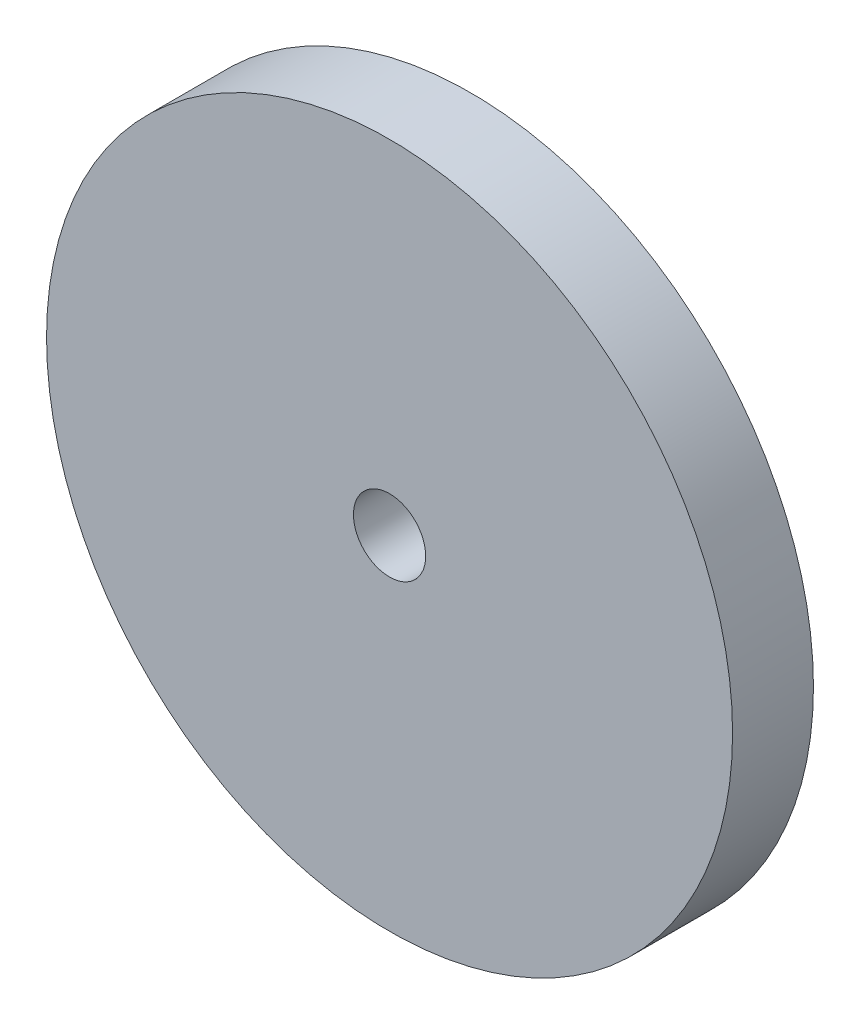
ISO-10303-21;
HEADER;
FILE_DESCRIPTION(('STEP AP214'),'2;1');
FILE_NAME('part.step','',(''),(''),'','','');
FILE_SCHEMA(('AUTOMOTIVE_DESIGN { 1 0 10303 214 1 1 1 1 }'));
ENDSEC;
DATA;
#1=APPLICATION_CONTEXT('core data for automotive mechanical design processes');
#2=APPLICATION_PROTOCOL_DEFINITION('international standard','automotive_design',2000,#1);
#3=PRODUCT_CONTEXT('',#1,'mechanical');
#4=PRODUCT('Part','Part','',(#3));
#5=PRODUCT_RELATED_PRODUCT_CATEGORY('part','',(#4));
#6=PRODUCT_DEFINITION_FORMATION('','',#4);
#7=PRODUCT_DEFINITION_CONTEXT('part definition',#1,'design');
#8=PRODUCT_DEFINITION('design','',#6,#7);
#9=PRODUCT_DEFINITION_SHAPE('','',#8);
#10=(LENGTH_UNIT() NAMED_UNIT(*) SI_UNIT(.MILLI.,.METRE.));
#11=(NAMED_UNIT(*) PLANE_ANGLE_UNIT() SI_UNIT($,.RADIAN.));
#12=(NAMED_UNIT(*) SI_UNIT($,.STERADIAN.) SOLID_ANGLE_UNIT());
#13=UNCERTAINTY_MEASURE_WITH_UNIT(LENGTH_MEASURE(1.E-05),#10,'distance_accuracy_value','');
#14=(GEOMETRIC_REPRESENTATION_CONTEXT(3) GLOBAL_UNCERTAINTY_ASSIGNED_CONTEXT((#13)) GLOBAL_UNIT_ASSIGNED_CONTEXT((#10,
#11,#12)) REPRESENTATION_CONTEXT('',''));
#15=CARTESIAN_POINT('',(0.,0.,0.));
#16=DIRECTION('',(0.,0.,1.));
#17=DIRECTION('',(1.,0.,0.));
#18=AXIS2_PLACEMENT_3D('',#15,#16,#17);
#19=CARTESIAN_POINT('',(0.,0.,3.556));
#20=DIRECTION('',(0.,0.,-1.));
#21=DIRECTION('',(-1.,0.,0.));
#22=AXIS2_PLACEMENT_3D('',#19,#20,#21);
#23=CYLINDRICAL_SURFACE('',#22,30.1625);
#24=CARTESIAN_POINT('',(0.,0.,3.556));
#25=DIRECTION('',(0.,0.,1.));
#26=DIRECTION('',(1.,0.,0.));
#27=AXIS2_PLACEMENT_3D('',#24,#25,#26);
#28=CIRCLE('',#27,30.1625);
#29=CARTESIAN_POINT('',(30.1625,0.,3.556));
#30=VERTEX_POINT('',#29);
#31=EDGE_CURVE('E10',#30,#30,#28,.T.);
#32=ORIENTED_EDGE('',*,*,#31,.F.);
#33=EDGE_LOOP('',(#32));
#34=FACE_BOUND('',#33,.T.);
#35=CARTESIAN_POINT('',(0.,0.,-3.556));
#36=DIRECTION('',(0.,0.,1.));
#37=DIRECTION('',(1.,0.,0.));
#38=AXIS2_PLACEMENT_3D('',#35,#36,#37);
#39=CIRCLE('',#38,30.1625);
#40=CARTESIAN_POINT('',(30.1625,0.,-3.556));
#41=VERTEX_POINT('',#40);
#42=EDGE_CURVE('E42',#41,#41,#39,.T.);
#43=ORIENTED_EDGE('',*,*,#42,.T.);
#44=EDGE_LOOP('',(#43));
#45=FACE_BOUND('',#44,.T.);
#46=ADVANCED_FACE('F39',(#34,#45),#23,.T.);
#47=CARTESIAN_POINT('',(0.,0.,3.556));
#48=DIRECTION('',(0.,0.,1.));
#49=DIRECTION('',(1.,0.,0.));
#50=AXIS2_PLACEMENT_3D('',#47,#48,#49);
#51=PLANE('',#50);
#52=CARTESIAN_POINT('',(0.,0.,3.556));
#53=DIRECTION('',(0.,0.,1.));
#54=DIRECTION('',(1.,0.,0.));
#55=AXIS2_PLACEMENT_3D('',#52,#53,#54);
#56=CIRCLE('',#55,3.175);
#57=CARTESIAN_POINT('',(3.175,0.,3.556));
#58=VERTEX_POINT('',#57);
#59=EDGE_CURVE('E56',#58,#58,#56,.T.);
#60=ORIENTED_EDGE('',*,*,#59,.F.);
#61=EDGE_LOOP('',(#60));
#62=FACE_BOUND('',#61,.T.);
#63=ORIENTED_EDGE('',*,*,#31,.T.);
#64=EDGE_LOOP('',(#63));
#65=FACE_BOUND('',#64,.T.);
#66=ADVANCED_FACE('F63',(#62,#65),#51,.T.);
#67=CARTESIAN_POINT('',(0.,0.,-3.556));
#68=DIRECTION('',(0.,0.,1.));
#69=DIRECTION('',(1.,0.,0.));
#70=AXIS2_PLACEMENT_3D('',#67,#68,#69);
#71=PLANE('',#70);
#72=CARTESIAN_POINT('',(0.,0.,-3.556));
#73=DIRECTION('',(0.,0.,1.));
#74=DIRECTION('',(1.,0.,0.));
#75=AXIS2_PLACEMENT_3D('',#72,#73,#74);
#76=CIRCLE('',#75,3.175);
#77=CARTESIAN_POINT('',(3.175,0.,-3.556));
#78=VERTEX_POINT('',#77);
#79=EDGE_CURVE('E51',#78,#78,#76,.T.);
#80=ORIENTED_EDGE('',*,*,#79,.T.);
#81=EDGE_LOOP('',(#80));
#82=FACE_BOUND('',#81,.T.);
#83=ORIENTED_EDGE('',*,*,#42,.F.);
#84=EDGE_LOOP('',(#83));
#85=FACE_BOUND('',#84,.T.);
#86=ADVANCED_FACE('F65',(#82,#85),#71,.F.);
#87=CARTESIAN_POINT('',(0.,0.,3.556));
#88=DIRECTION('',(0.,0.,1.));
#89=DIRECTION('',(1.,0.,0.));
#90=AXIS2_PLACEMENT_3D('',#87,#88,#89);
#91=CYLINDRICAL_SURFACE('',#90,3.175);
#92=ORIENTED_EDGE('',*,*,#79,.F.);
#93=EDGE_LOOP('',(#92));
#94=FACE_BOUND('',#93,.T.);
#95=ORIENTED_EDGE('',*,*,#59,.T.);
#96=EDGE_LOOP('',(#95));
#97=FACE_BOUND('',#96,.T.);
#98=ADVANCED_FACE('F61',(#94,#97),#91,.F.);
#99=CLOSED_SHELL('',(#46,#66,#86,#98));
#100=MANIFOLD_SOLID_BREP('B2',#99);
#101=ADVANCED_BREP_SHAPE_REPRESENTATION('',(#18,#100),#14);
#102=SHAPE_DEFINITION_REPRESENTATION(#9,#101);
ENDSEC;
END-ISO-10303-21;
